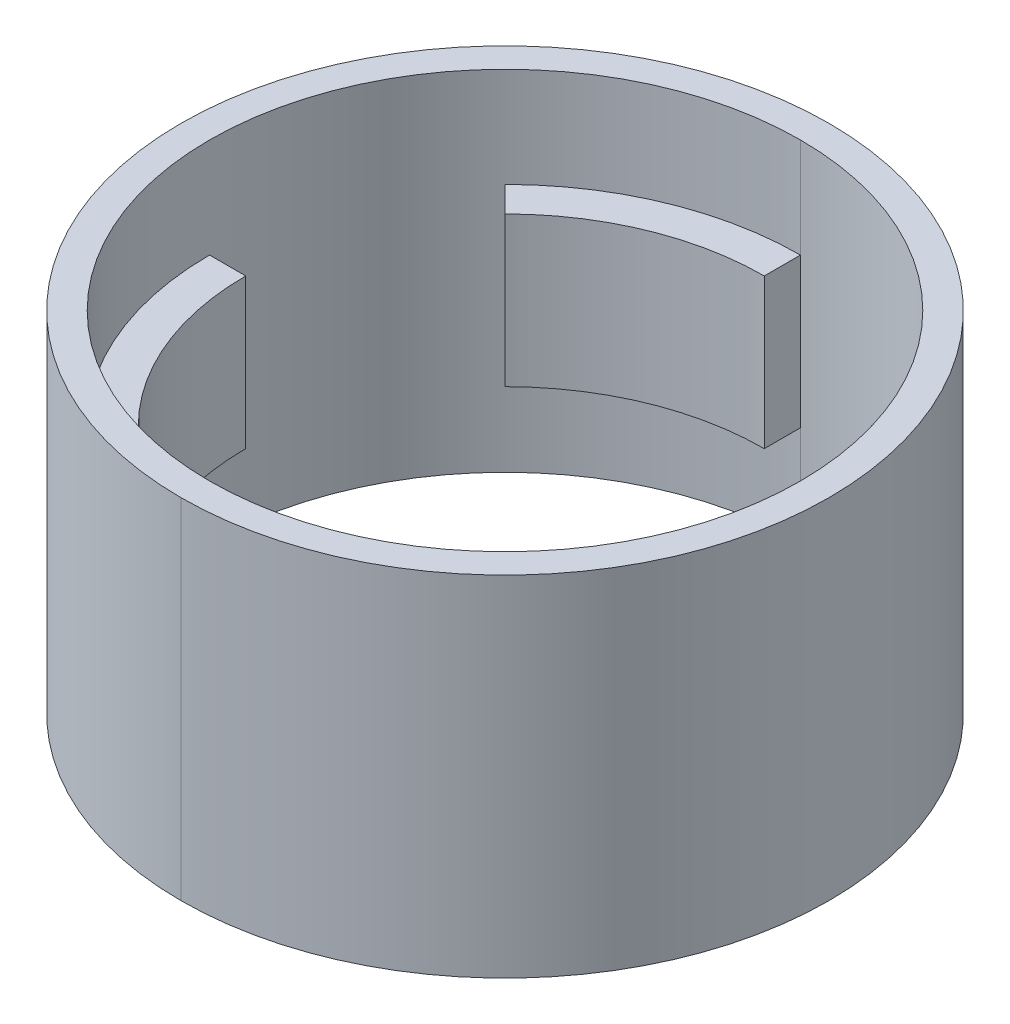
ISO-10303-21;
HEADER;
FILE_DESCRIPTION(('STEP AP214'),'2;1');
FILE_NAME('part.step','',(''),(''),'','','');
FILE_SCHEMA(('AUTOMOTIVE_DESIGN { 1 0 10303 214 1 1 1 1 }'));
ENDSEC;
DATA;
#1=APPLICATION_CONTEXT('core data for automotive mechanical design processes');
#2=APPLICATION_PROTOCOL_DEFINITION('international standard','automotive_design',2000,#1);
#3=PRODUCT_CONTEXT('',#1,'mechanical');
#4=PRODUCT('Part','Part','',(#3));
#5=PRODUCT_RELATED_PRODUCT_CATEGORY('part','',(#4));
#6=PRODUCT_DEFINITION_FORMATION('','',#4);
#7=PRODUCT_DEFINITION_CONTEXT('part definition',#1,'design');
#8=PRODUCT_DEFINITION('design','',#6,#7);
#9=PRODUCT_DEFINITION_SHAPE('','',#8);
#10=(LENGTH_UNIT() NAMED_UNIT(*) SI_UNIT(.MILLI.,.METRE.));
#11=(NAMED_UNIT(*) PLANE_ANGLE_UNIT() SI_UNIT($,.RADIAN.));
#12=(NAMED_UNIT(*) SI_UNIT($,.STERADIAN.) SOLID_ANGLE_UNIT());
#13=UNCERTAINTY_MEASURE_WITH_UNIT(LENGTH_MEASURE(1.E-05),#10,'distance_accuracy_value','');
#14=(GEOMETRIC_REPRESENTATION_CONTEXT(3) GLOBAL_UNCERTAINTY_ASSIGNED_CONTEXT((#13)) GLOBAL_UNIT_ASSIGNED_CONTEXT((#10,
#11,#12)) REPRESENTATION_CONTEXT('',''));
#15=CARTESIAN_POINT('',(0.,0.,0.));
#16=DIRECTION('',(0.,0.,1.));
#17=DIRECTION('',(1.,0.,0.));
#18=AXIS2_PLACEMENT_3D('',#15,#16,#17);
#19=CARTESIAN_POINT('',(0.,-7.25463117847063,0.));
#20=DIRECTION('',(0.,0.,1.));
#21=DIRECTION('',(1.,0.,0.));
#22=AXIS2_PLACEMENT_3D('',#19,#20,#21);
#23=PLANE('',#22);
#24=DIRECTION('',(1.,0.,0.));
#25=VECTOR('',#24,1.);
#26=CARTESIAN_POINT('',(0.,-2.5,0.));
#27=LINE('',#26,#25);
#28=CARTESIAN_POINT('',(5.2,-2.5,0.));
#29=VERTEX_POINT('',#28);
#30=CARTESIAN_POINT('',(5.925,-2.5,0.));
#31=VERTEX_POINT('',#30);
#32=EDGE_CURVE('E372',#29,#31,#27,.T.);
#33=ORIENTED_EDGE('',*,*,#32,.T.);
#34=DIRECTION('',(0.,1.,0.));
#35=VECTOR('',#34,1.);
#36=CARTESIAN_POINT('',(5.925,-7.25463117847063,0.));
#37=LINE('',#36,#35);
#38=CARTESIAN_POINT('',(5.925,0.5,0.));
#39=VERTEX_POINT('',#38);
#40=EDGE_CURVE('E26',#31,#39,#37,.T.);
#41=ORIENTED_EDGE('',*,*,#40,.T.);
#42=DIRECTION('',(1.,0.,0.));
#43=VECTOR('',#42,1.);
#44=CARTESIAN_POINT('',(0.,0.5,0.));
#45=LINE('',#44,#43);
#46=CARTESIAN_POINT('',(5.2,0.5,0.));
#47=VERTEX_POINT('',#46);
#48=EDGE_CURVE('E367',#47,#39,#45,.T.);
#49=ORIENTED_EDGE('',*,*,#48,.F.);
#50=DIRECTION('',(0.,1.,0.));
#51=VECTOR('',#50,1.);
#52=CARTESIAN_POINT('',(5.2,-7.25463117847063,0.));
#53=LINE('',#52,#51);
#54=EDGE_CURVE('E307',#29,#47,#53,.T.);
#55=ORIENTED_EDGE('',*,*,#54,.F.);
#56=EDGE_LOOP('',(#33,#41,#49,#55));
#57=FACE_BOUND('',#56,.T.);
#58=ADVANCED_FACE('F15',(#57),#23,.T.);
#59=CARTESIAN_POINT('',(0.,-7.25463117847063,0.));
#60=DIRECTION('',(-0.707106781186547,0.,0.707106781186548));
#61=DIRECTION('',(0.,1.,0.));
#62=AXIS2_PLACEMENT_3D('',#59,#60,#61);
#63=PLANE('',#62);
#64=DIRECTION('',(0.,1.,0.));
#65=VECTOR('',#64,1.);
#66=CARTESIAN_POINT('',(3.67695526217005,-7.25463117847063,3.67695526217004));
#67=LINE('',#66,#65);
#68=CARTESIAN_POINT('',(3.67695526217005,-2.5,3.67695526217004));
#69=VERTEX_POINT('',#68);
#70=CARTESIAN_POINT('',(3.67695526217005,0.5,3.67695526217004));
#71=VERTEX_POINT('',#70);
#72=EDGE_CURVE('E117',#69,#71,#67,.T.);
#73=ORIENTED_EDGE('',*,*,#72,.T.);
#74=DIRECTION('',(0.707106781186548,0.,0.707106781186547));
#75=VECTOR('',#74,1.);
#76=CARTESIAN_POINT('',(0.,0.5,0.));
#77=LINE('',#76,#75);
#78=CARTESIAN_POINT('',(4.18960767853029,0.5,4.18960767853029));
#79=VERTEX_POINT('',#78);
#80=EDGE_CURVE('E336',#71,#79,#77,.T.);
#81=ORIENTED_EDGE('',*,*,#80,.T.);
#82=DIRECTION('',(0.,1.,0.));
#83=VECTOR('',#82,1.);
#84=CARTESIAN_POINT('',(4.18960767853029,-7.25463117847063,4.18960767853029));
#85=LINE('',#84,#83);
#86=CARTESIAN_POINT('',(4.18960767853029,-2.5,4.18960767853029));
#87=VERTEX_POINT('',#86);
#88=EDGE_CURVE('E153',#87,#79,#85,.T.);
#89=ORIENTED_EDGE('',*,*,#88,.F.);
#90=DIRECTION('',(0.707106781186548,0.,0.707106781186547));
#91=VECTOR('',#90,1.);
#92=CARTESIAN_POINT('',(0.,-2.5,0.));
#93=LINE('',#92,#91);
#94=EDGE_CURVE('E303',#69,#87,#93,.T.);
#95=ORIENTED_EDGE('',*,*,#94,.F.);
#96=EDGE_LOOP('',(#73,#81,#89,#95));
#97=FACE_BOUND('',#96,.T.);
#98=ADVANCED_FACE('F17',(#97),#63,.F.);
#99=CARTESIAN_POINT('',(0.,-7.25463117847063,0.));
#100=DIRECTION('',(0.707106781186547,0.,0.707106781186548));
#101=DIRECTION('',(0.,-1.,0.));
#102=AXIS2_PLACEMENT_3D('',#99,#100,#101);
#103=PLANE('',#102);
#104=DIRECTION('',(0.707106781186548,0.,-0.707106781186547));
#105=VECTOR('',#104,1.);
#106=CARTESIAN_POINT('',(0.,-2.5,0.));
#107=LINE('',#106,#105);
#108=CARTESIAN_POINT('',(-4.18960767853029,-2.5,4.18960767853029));
#109=VERTEX_POINT('',#108);
#110=CARTESIAN_POINT('',(-3.67695526217004,-2.5,3.67695526217005));
#111=VERTEX_POINT('',#110);
#112=EDGE_CURVE('E362',#109,#111,#107,.T.);
#113=ORIENTED_EDGE('',*,*,#112,.T.);
#114=DIRECTION('',(0.,1.,0.));
#115=VECTOR('',#114,1.);
#116=CARTESIAN_POINT('',(-3.67695526217004,-7.25463117847063,3.67695526217005));
#117=LINE('',#116,#115);
#118=CARTESIAN_POINT('',(-3.67695526217004,0.5,3.67695526217005));
#119=VERTEX_POINT('',#118);
#120=EDGE_CURVE('E276',#111,#119,#117,.T.);
#121=ORIENTED_EDGE('',*,*,#120,.T.);
#122=DIRECTION('',(0.707106781186548,0.,-0.707106781186547));
#123=VECTOR('',#122,1.);
#124=CARTESIAN_POINT('',(0.,0.5,0.));
#125=LINE('',#124,#123);
#126=CARTESIAN_POINT('',(-4.18960767853029,0.5,4.18960767853029));
#127=VERTEX_POINT('',#126);
#128=EDGE_CURVE('E287',#127,#119,#125,.T.);
#129=ORIENTED_EDGE('',*,*,#128,.F.);
#130=DIRECTION('',(0.,1.,0.));
#131=VECTOR('',#130,1.);
#132=CARTESIAN_POINT('',(-4.18960767853029,-7.25463117847063,4.18960767853029));
#133=LINE('',#132,#131);
#134=EDGE_CURVE('E335',#109,#127,#133,.T.);
#135=ORIENTED_EDGE('',*,*,#134,.F.);
#136=EDGE_LOOP('',(#113,#121,#129,#135));
#137=FACE_BOUND('',#136,.T.);
#138=ADVANCED_FACE('F647',(#137),#103,.T.);
#139=CARTESIAN_POINT('',(0.,-7.25463117847063,0.));
#140=DIRECTION('',(-1.,0.,0.));
#141=DIRECTION('',(0.,0.,1.));
#142=AXIS2_PLACEMENT_3D('',#139,#140,#141);
#143=PLANE('',#142);
#144=DIRECTION('',(0.,0.,1.));
#145=VECTOR('',#144,1.);
#146=CARTESIAN_POINT('',(0.,-2.5,0.));
#147=LINE('',#146,#145);
#148=CARTESIAN_POINT('',(0.,-2.5,5.2));
#149=VERTEX_POINT('',#148);
#150=CARTESIAN_POINT('',(0.,-2.5,5.925));
#151=VERTEX_POINT('',#150);
#152=EDGE_CURVE('E302',#149,#151,#147,.T.);
#153=ORIENTED_EDGE('',*,*,#152,.T.);
#154=DIRECTION('',(0.,1.,0.));
#155=VECTOR('',#154,1.);
#156=CARTESIAN_POINT('',(0.,-7.25463117847063,5.925));
#157=LINE('',#156,#155);
#158=CARTESIAN_POINT('',(0.,0.5,5.925));
#159=VERTEX_POINT('',#158);
#160=EDGE_CURVE('E277',#151,#159,#157,.T.);
#161=ORIENTED_EDGE('',*,*,#160,.T.);
#162=DIRECTION('',(0.,0.,1.));
#163=VECTOR('',#162,1.);
#164=CARTESIAN_POINT('',(0.,0.5,0.));
#165=LINE('',#164,#163);
#166=CARTESIAN_POINT('',(0.,0.5,5.2));
#167=VERTEX_POINT('',#166);
#168=EDGE_CURVE('E288',#167,#159,#165,.T.);
#169=ORIENTED_EDGE('',*,*,#168,.F.);
#170=DIRECTION('',(0.,1.,0.));
#171=VECTOR('',#170,1.);
#172=CARTESIAN_POINT('',(0.,-7.25463117847063,5.2));
#173=LINE('',#172,#171);
#174=EDGE_CURVE('E347',#149,#167,#173,.T.);
#175=ORIENTED_EDGE('',*,*,#174,.F.);
#176=EDGE_LOOP('',(#153,#161,#169,#175));
#177=FACE_BOUND('',#176,.T.);
#178=ADVANCED_FACE('F651',(#177),#143,.T.);
#179=CARTESIAN_POINT('',(0.,-7.25463117847063,0.));
#180=DIRECTION('',(-0.707106781186547,0.,0.707106781186548));
#181=DIRECTION('',(0.,1.,0.));
#182=AXIS2_PLACEMENT_3D('',#179,#180,#181);
#183=PLANE('',#182);
#184=DIRECTION('',(0.707106781186548,0.,0.707106781186547));
#185=VECTOR('',#184,1.);
#186=CARTESIAN_POINT('',(0.,-2.5,0.));
#187=LINE('',#186,#185);
#188=CARTESIAN_POINT('',(-4.18960767853029,-2.5,-4.18960767853029));
#189=VERTEX_POINT('',#188);
#190=CARTESIAN_POINT('',(-3.67695526217004,-2.5,-3.67695526217005));
#191=VERTEX_POINT('',#190);
#192=EDGE_CURVE('E272',#189,#191,#187,.T.);
#193=ORIENTED_EDGE('',*,*,#192,.T.);
#194=DIRECTION('',(0.,1.,0.));
#195=VECTOR('',#194,1.);
#196=CARTESIAN_POINT('',(-3.67695526217004,-7.25463117847063,-3.67695526217005));
#197=LINE('',#196,#195);
#198=CARTESIAN_POINT('',(-3.67695526217004,0.5,-3.67695526217005));
#199=VERTEX_POINT('',#198);
#200=EDGE_CURVE('E41',#191,#199,#197,.T.);
#201=ORIENTED_EDGE('',*,*,#200,.T.);
#202=DIRECTION('',(0.707106781186548,0.,0.707106781186547));
#203=VECTOR('',#202,1.);
#204=CARTESIAN_POINT('',(0.,0.5,0.));
#205=LINE('',#204,#203);
#206=CARTESIAN_POINT('',(-4.18960767853029,0.5,-4.18960767853029));
#207=VERTEX_POINT('',#206);
#208=EDGE_CURVE('E216',#207,#199,#205,.T.);
#209=ORIENTED_EDGE('',*,*,#208,.F.);
#210=DIRECTION('',(0.,1.,0.));
#211=VECTOR('',#210,1.);
#212=CARTESIAN_POINT('',(-4.18960767853029,-7.25463117847063,-4.18960767853029));
#213=LINE('',#212,#211);
#214=EDGE_CURVE('E260',#189,#207,#213,.T.);
#215=ORIENTED_EDGE('',*,*,#214,.F.);
#216=EDGE_LOOP('',(#193,#201,#209,#215));
#217=FACE_BOUND('',#216,.T.);
#218=ADVANCED_FACE('F731',(#217),#183,.T.);
#219=CARTESIAN_POINT('',(0.,-7.25463117847063,0.));
#220=DIRECTION('',(0.,0.,1.));
#221=DIRECTION('',(1.,0.,0.));
#222=AXIS2_PLACEMENT_3D('',#219,#220,#221);
#223=PLANE('',#222);
#224=DIRECTION('',(0.,1.,0.));
#225=VECTOR('',#224,1.);
#226=CARTESIAN_POINT('',(-5.925,-7.25463117847063,0.));
#227=LINE('',#226,#225);
#228=CARTESIAN_POINT('',(-5.925,-2.5,0.));
#229=VERTEX_POINT('',#228);
#230=CARTESIAN_POINT('',(-5.925,0.5,0.));
#231=VERTEX_POINT('',#230);
#232=EDGE_CURVE('E324',#229,#231,#227,.T.);
#233=ORIENTED_EDGE('',*,*,#232,.T.);
#234=DIRECTION('',(1.,0.,0.));
#235=VECTOR('',#234,1.);
#236=CARTESIAN_POINT('',(0.,0.5,0.));
#237=LINE('',#236,#235);
#238=CARTESIAN_POINT('',(-5.2,0.5,0.));
#239=VERTEX_POINT('',#238);
#240=EDGE_CURVE('E403',#231,#239,#237,.T.);
#241=ORIENTED_EDGE('',*,*,#240,.T.);
#242=DIRECTION('',(0.,1.,0.));
#243=VECTOR('',#242,1.);
#244=CARTESIAN_POINT('',(-5.2,-7.25463117847063,0.));
#245=LINE('',#244,#243);
#246=CARTESIAN_POINT('',(-5.2,-2.5,0.));
#247=VERTEX_POINT('',#246);
#248=EDGE_CURVE('E274',#247,#239,#245,.T.);
#249=ORIENTED_EDGE('',*,*,#248,.F.);
#250=DIRECTION('',(1.,0.,0.));
#251=VECTOR('',#250,1.);
#252=CARTESIAN_POINT('',(0.,-2.5,0.));
#253=LINE('',#252,#251);
#254=EDGE_CURVE('E293',#229,#247,#253,.T.);
#255=ORIENTED_EDGE('',*,*,#254,.F.);
#256=EDGE_LOOP('',(#233,#241,#249,#255));
#257=FACE_BOUND('',#256,.T.);
#258=ADVANCED_FACE('F726',(#257),#223,.F.);
#259=CARTESIAN_POINT('',(0.,-7.25463117847063,0.));
#260=DIRECTION('',(-1.,0.,0.));
#261=DIRECTION('',(0.,0.,1.));
#262=AXIS2_PLACEMENT_3D('',#259,#260,#261);
#263=PLANE('',#262);
#264=DIRECTION('',(0.,1.,0.));
#265=VECTOR('',#264,1.);
#266=CARTESIAN_POINT('',(0.,-7.25463117847063,-5.925));
#267=LINE('',#266,#265);
#268=CARTESIAN_POINT('',(0.,-2.5,-5.925));
#269=VERTEX_POINT('',#268);
#270=CARTESIAN_POINT('',(0.,0.5,-5.925));
#271=VERTEX_POINT('',#270);
#272=EDGE_CURVE('E224',#269,#271,#267,.T.);
#273=ORIENTED_EDGE('',*,*,#272,.T.);
#274=DIRECTION('',(0.,0.,1.));
#275=VECTOR('',#274,1.);
#276=CARTESIAN_POINT('',(0.,0.5,0.));
#277=LINE('',#276,#275);
#278=CARTESIAN_POINT('',(0.,0.5,-5.2));
#279=VERTEX_POINT('',#278);
#280=EDGE_CURVE('E227',#271,#279,#277,.T.);
#281=ORIENTED_EDGE('',*,*,#280,.T.);
#282=DIRECTION('',(0.,1.,0.));
#283=VECTOR('',#282,1.);
#284=CARTESIAN_POINT('',(0.,-7.25463117847063,-5.2));
#285=LINE('',#284,#283);
#286=CARTESIAN_POINT('',(0.,-2.5,-5.2));
#287=VERTEX_POINT('',#286);
#288=EDGE_CURVE('E316',#287,#279,#285,.T.);
#289=ORIENTED_EDGE('',*,*,#288,.F.);
#290=DIRECTION('',(0.,0.,1.));
#291=VECTOR('',#290,1.);
#292=CARTESIAN_POINT('',(0.,-2.5,0.));
#293=LINE('',#292,#291);
#294=EDGE_CURVE('E230',#269,#287,#293,.T.);
#295=ORIENTED_EDGE('',*,*,#294,.F.);
#296=EDGE_LOOP('',(#273,#281,#289,#295));
#297=FACE_BOUND('',#296,.T.);
#298=ADVANCED_FACE('F226',(#297),#263,.F.);
#299=CARTESIAN_POINT('',(0.,-7.25463117847063,0.));
#300=DIRECTION('',(0.707106781186547,0.,0.707106781186548));
#301=DIRECTION('',(0.,-1.,0.));
#302=AXIS2_PLACEMENT_3D('',#299,#300,#301);
#303=PLANE('',#302);
#304=DIRECTION('',(0.,1.,0.));
#305=VECTOR('',#304,1.);
#306=CARTESIAN_POINT('',(3.67695526217005,-7.25463117847063,-3.67695526217004));
#307=LINE('',#306,#305);
#308=CARTESIAN_POINT('',(3.67695526217005,-2.5,-3.67695526217004));
#309=VERTEX_POINT('',#308);
#310=CARTESIAN_POINT('',(3.67695526217005,0.5,-3.67695526217004));
#311=VERTEX_POINT('',#310);
#312=EDGE_CURVE('E304',#309,#311,#307,.T.);
#313=ORIENTED_EDGE('',*,*,#312,.T.);
#314=DIRECTION('',(0.707106781186548,0.,-0.707106781186547));
#315=VECTOR('',#314,1.);
#316=CARTESIAN_POINT('',(0.,0.5,0.));
#317=LINE('',#316,#315);
#318=CARTESIAN_POINT('',(4.18960767853029,0.5,-4.18960767853029));
#319=VERTEX_POINT('',#318);
#320=EDGE_CURVE('E19',#311,#319,#317,.T.);
#321=ORIENTED_EDGE('',*,*,#320,.T.);
#322=DIRECTION('',(0.,1.,0.));
#323=VECTOR('',#322,1.);
#324=CARTESIAN_POINT('',(4.18960767853029,-7.25463117847063,-4.18960767853029));
#325=LINE('',#324,#323);
#326=CARTESIAN_POINT('',(4.18960767853029,-2.5,-4.18960767853029));
#327=VERTEX_POINT('',#326);
#328=EDGE_CURVE('E10',#327,#319,#325,.T.);
#329=ORIENTED_EDGE('',*,*,#328,.F.);
#330=DIRECTION('',(0.707106781186548,0.,-0.707106781186547));
#331=VECTOR('',#330,1.);
#332=CARTESIAN_POINT('',(0.,-2.5,0.));
#333=LINE('',#332,#331);
#334=EDGE_CURVE('E415',#309,#327,#333,.T.);
#335=ORIENTED_EDGE('',*,*,#334,.F.);
#336=EDGE_LOOP('',(#313,#321,#329,#335));
#337=FACE_BOUND('',#336,.T.);
#338=ADVANCED_FACE('F725',(#337),#303,.F.);
#339=CARTESIAN_POINT('',(0.,-4.5,0.));
#340=DIRECTION('',(0.,-1.,0.));
#341=DIRECTION('',(0.,0.,-1.));
#342=AXIS2_PLACEMENT_3D('',#339,#340,#341);
#343=PLANE('',#342);
#344=CARTESIAN_POINT('',(0.,-4.5,0.));
#345=DIRECTION('',(0.,-1.,0.));
#346=DIRECTION('',(0.,0.,-1.));
#347=AXIS2_PLACEMENT_3D('',#344,#345,#346);
#348=CIRCLE('',#347,5.925);
#349=CARTESIAN_POINT('',(0.,-4.5,5.925));
#350=VERTEX_POINT('',#349);
#351=CARTESIAN_POINT('',(0.,-4.5,-5.925));
#352=VERTEX_POINT('',#351);
#353=EDGE_CURVE('E329',#350,#352,#348,.T.);
#354=ORIENTED_EDGE('',*,*,#353,.F.);
#355=CARTESIAN_POINT('',(0.,-4.5,0.));
#356=DIRECTION('',(0.,-1.,0.));
#357=DIRECTION('',(0.,0.,-1.));
#358=AXIS2_PLACEMENT_3D('',#355,#356,#357);
#359=CIRCLE('',#358,5.925);
#360=EDGE_CURVE('E382',#352,#350,#359,.T.);
#361=ORIENTED_EDGE('',*,*,#360,.F.);
#362=EDGE_LOOP('',(#354,#361));
#363=FACE_BOUND('',#362,.T.);
#364=CARTESIAN_POINT('',(0.,-4.5,0.));
#365=DIRECTION('',(0.,-1.,0.));
#366=DIRECTION('',(0.,0.,-1.));
#367=AXIS2_PLACEMENT_3D('',#364,#365,#366);
#368=CIRCLE('',#367,6.5);
#369=CARTESIAN_POINT('',(0.,-4.5,-6.5));
#370=VERTEX_POINT('',#369);
#371=CARTESIAN_POINT('',(0.,-4.5,6.5));
#372=VERTEX_POINT('',#371);
#373=EDGE_CURVE('E407',#370,#372,#368,.T.);
#374=ORIENTED_EDGE('',*,*,#373,.T.);
#375=CARTESIAN_POINT('',(0.,-4.5,0.));
#376=DIRECTION('',(0.,-1.,0.));
#377=DIRECTION('',(0.,0.,-1.));
#378=AXIS2_PLACEMENT_3D('',#375,#376,#377);
#379=CIRCLE('',#378,6.5);
#380=EDGE_CURVE('E393',#372,#370,#379,.T.);
#381=ORIENTED_EDGE('',*,*,#380,.T.);
#382=EDGE_LOOP('',(#374,#381));
#383=FACE_BOUND('',#382,.T.);
#384=ADVANCED_FACE('F777',(#363,#383),#343,.T.);
#385=CARTESIAN_POINT('',(0.,0.5,0.));
#386=DIRECTION('',(0.,1.,0.));
#387=DIRECTION('',(0.,0.,1.));
#388=AXIS2_PLACEMENT_3D('',#385,#386,#387);
#389=CYLINDRICAL_SURFACE('',#388,5.925);
#390=CARTESIAN_POINT('',(0.,0.5,0.));
#391=DIRECTION('',(0.,1.,0.));
#392=DIRECTION('',(0.,0.,1.));
#393=AXIS2_PLACEMENT_3D('',#390,#391,#392);
#394=CIRCLE('',#393,5.925);
#395=EDGE_CURVE('E388',#39,#319,#394,.T.);
#396=ORIENTED_EDGE('',*,*,#395,.F.);
#397=ORIENTED_EDGE('',*,*,#40,.F.);
#398=CARTESIAN_POINT('',(0.,-2.5,0.));
#399=DIRECTION('',(0.,-1.,0.));
#400=DIRECTION('',(0.,0.,-1.));
#401=AXIS2_PLACEMENT_3D('',#398,#399,#400);
#402=CIRCLE('',#401,5.925);
#403=EDGE_CURVE('E244',#327,#31,#402,.T.);
#404=ORIENTED_EDGE('',*,*,#403,.F.);
#405=ORIENTED_EDGE('',*,*,#328,.T.);
#406=EDGE_LOOP('',(#396,#397,#404,#405));
#407=FACE_BOUND('',#406,.T.);
#408=DIRECTION('',(0.,1.,0.));
#409=VECTOR('',#408,1.);
#410=CARTESIAN_POINT('',(0.,0.5,-5.925));
#411=LINE('',#410,#409);
#412=EDGE_CURVE('E325',#352,#269,#411,.T.);
#413=ORIENTED_EDGE('',*,*,#412,.F.);
#414=ORIENTED_EDGE('',*,*,#360,.T.);
#415=DIRECTION('',(0.,1.,0.));
#416=VECTOR('',#415,1.);
#417=CARTESIAN_POINT('',(0.,0.5,5.925));
#418=LINE('',#417,#416);
#419=EDGE_CURVE('E281',#350,#151,#418,.T.);
#420=ORIENTED_EDGE('',*,*,#419,.T.);
#421=CARTESIAN_POINT('',(0.,-2.5,0.));
#422=DIRECTION('',(0.,-1.,0.));
#423=DIRECTION('',(0.,0.,-1.));
#424=AXIS2_PLACEMENT_3D('',#421,#422,#423);
#425=CIRCLE('',#424,5.925);
#426=EDGE_CURVE('E298',#87,#151,#425,.T.);
#427=ORIENTED_EDGE('',*,*,#426,.F.);
#428=ORIENTED_EDGE('',*,*,#88,.T.);
#429=CARTESIAN_POINT('',(0.,0.5,0.));
#430=DIRECTION('',(0.,1.,0.));
#431=DIRECTION('',(0.,0.,1.));
#432=AXIS2_PLACEMENT_3D('',#429,#430,#431);
#433=CIRCLE('',#432,5.925);
#434=EDGE_CURVE('E283',#159,#79,#433,.T.);
#435=ORIENTED_EDGE('',*,*,#434,.F.);
#436=DIRECTION('',(0.,1.,0.));
#437=VECTOR('',#436,1.);
#438=CARTESIAN_POINT('',(0.,0.5,5.925));
#439=LINE('',#438,#437);
#440=CARTESIAN_POINT('',(0.,2.5,5.925));
#441=VERTEX_POINT('',#440);
#442=EDGE_CURVE('E282',#159,#441,#439,.T.);
#443=ORIENTED_EDGE('',*,*,#442,.T.);
#444=CARTESIAN_POINT('',(0.,2.5,0.));
#445=DIRECTION('',(0.,1.,0.));
#446=DIRECTION('',(0.,0.,1.));
#447=AXIS2_PLACEMENT_3D('',#444,#445,#446);
#448=CIRCLE('',#447,5.925);
#449=CARTESIAN_POINT('',(0.,2.5,-5.925));
#450=VERTEX_POINT('',#449);
#451=EDGE_CURVE('E250',#441,#450,#448,.T.);
#452=ORIENTED_EDGE('',*,*,#451,.T.);
#453=DIRECTION('',(0.,1.,0.));
#454=VECTOR('',#453,1.);
#455=CARTESIAN_POINT('',(0.,0.5,-5.925));
#456=LINE('',#455,#454);
#457=EDGE_CURVE('E247',#271,#450,#456,.T.);
#458=ORIENTED_EDGE('',*,*,#457,.F.);
#459=ORIENTED_EDGE('',*,*,#272,.F.);
#460=EDGE_LOOP('',(#413,#414,#420,#427,#428,#435,#443,#452,#458,#459));
#461=FACE_BOUND('',#460,.T.);
#462=ADVANCED_FACE('F248',(#407,#461),#389,.F.);
#463=CARTESIAN_POINT('',(0.,2.5,0.));
#464=DIRECTION('',(0.,-1.,0.));
#465=DIRECTION('',(0.,0.,-1.));
#466=AXIS2_PLACEMENT_3D('',#463,#464,#465);
#467=CYLINDRICAL_SURFACE('',#466,6.5);
#468=DIRECTION('',(0.,-1.,0.));
#469=VECTOR('',#468,1.);
#470=CARTESIAN_POINT('',(0.,2.5,6.5));
#471=LINE('',#470,#469);
#472=CARTESIAN_POINT('',(0.,2.5,6.5));
#473=VERTEX_POINT('',#472);
#474=EDGE_CURVE('E334',#473,#372,#471,.T.);
#475=ORIENTED_EDGE('',*,*,#474,.F.);
#476=CARTESIAN_POINT('',(0.,2.5,0.));
#477=DIRECTION('',(0.,1.,0.));
#478=DIRECTION('',(0.,0.,1.));
#479=AXIS2_PLACEMENT_3D('',#476,#477,#478);
#480=CIRCLE('',#479,6.5);
#481=CARTESIAN_POINT('',(0.,2.5,-6.5));
#482=VERTEX_POINT('',#481);
#483=EDGE_CURVE('E342',#482,#473,#480,.T.);
#484=ORIENTED_EDGE('',*,*,#483,.F.);
#485=DIRECTION('',(0.,-1.,0.));
#486=VECTOR('',#485,1.);
#487=CARTESIAN_POINT('',(0.,2.5,-6.5));
#488=LINE('',#487,#486);
#489=EDGE_CURVE('E368',#482,#370,#488,.T.);
#490=ORIENTED_EDGE('',*,*,#489,.T.);
#491=ORIENTED_EDGE('',*,*,#380,.F.);
#492=EDGE_LOOP('',(#475,#484,#490,#491));
#493=FACE_BOUND('',#492,.T.);
#494=ADVANCED_FACE('F743',(#493),#467,.T.);
#495=CARTESIAN_POINT('',(0.,2.5,0.));
#496=DIRECTION('',(0.,1.,0.));
#497=DIRECTION('',(1.,0.,0.));
#498=AXIS2_PLACEMENT_3D('',#495,#496,#497);
#499=PLANE('',#498);
#500=ORIENTED_EDGE('',*,*,#451,.F.);
#501=CARTESIAN_POINT('',(0.,2.5,0.));
#502=DIRECTION('',(0.,1.,0.));
#503=DIRECTION('',(0.,0.,1.));
#504=AXIS2_PLACEMENT_3D('',#501,#502,#503);
#505=CIRCLE('',#504,5.925);
#506=EDGE_CURVE('E255',#450,#441,#505,.T.);
#507=ORIENTED_EDGE('',*,*,#506,.F.);
#508=EDGE_LOOP('',(#500,#507));
#509=FACE_BOUND('',#508,.T.);
#510=ORIENTED_EDGE('',*,*,#483,.T.);
#511=CARTESIAN_POINT('',(0.,2.5,0.));
#512=DIRECTION('',(0.,1.,0.));
#513=DIRECTION('',(0.,0.,1.));
#514=AXIS2_PLACEMENT_3D('',#511,#512,#513);
#515=CIRCLE('',#514,6.5);
#516=EDGE_CURVE('E330',#473,#482,#515,.T.);
#517=ORIENTED_EDGE('',*,*,#516,.T.);
#518=EDGE_LOOP('',(#510,#517));
#519=FACE_BOUND('',#518,.T.);
#520=ADVANCED_FACE('F739',(#509,#519),#499,.T.);
#521=CARTESIAN_POINT('',(0.,18.8847763108502,0.));
#522=DIRECTION('',(0.,-1.,0.));
#523=DIRECTION('',(0.,0.,-1.));
#524=AXIS2_PLACEMENT_3D('',#521,#522,#523);
#525=CYLINDRICAL_SURFACE('',#524,5.2);
#526=CARTESIAN_POINT('',(0.,0.5,0.));
#527=DIRECTION('',(0.,1.,0.));
#528=DIRECTION('',(0.,0.,1.));
#529=AXIS2_PLACEMENT_3D('',#526,#527,#528);
#530=CIRCLE('',#529,5.2);
#531=EDGE_CURVE('E242',#279,#199,#530,.T.);
#532=ORIENTED_EDGE('',*,*,#531,.T.);
#533=ORIENTED_EDGE('',*,*,#200,.F.);
#534=CARTESIAN_POINT('',(0.,-2.5,0.));
#535=DIRECTION('',(0.,1.,0.));
#536=DIRECTION('',(0.,0.,-1.));
#537=AXIS2_PLACEMENT_3D('',#534,#535,#536);
#538=CIRCLE('',#537,5.2);
#539=EDGE_CURVE('E289',#287,#191,#538,.T.);
#540=ORIENTED_EDGE('',*,*,#539,.F.);
#541=ORIENTED_EDGE('',*,*,#288,.T.);
#542=EDGE_LOOP('',(#532,#533,#540,#541));
#543=FACE_BOUND('',#542,.T.);
#544=ADVANCED_FACE('F693',(#543),#525,.F.);
#545=CARTESIAN_POINT('',(0.,18.8847763108502,0.));
#546=DIRECTION('',(0.,-1.,0.));
#547=DIRECTION('',(0.,0.,-1.));
#548=AXIS2_PLACEMENT_3D('',#545,#546,#547);
#549=CYLINDRICAL_SURFACE('',#548,5.2);
#550=CARTESIAN_POINT('',(0.,0.5,0.));
#551=DIRECTION('',(0.,1.,0.));
#552=DIRECTION('',(0.,0.,1.));
#553=AXIS2_PLACEMENT_3D('',#550,#551,#552);
#554=CIRCLE('',#553,5.2);
#555=EDGE_CURVE('E399',#239,#119,#554,.T.);
#556=ORIENTED_EDGE('',*,*,#555,.T.);
#557=ORIENTED_EDGE('',*,*,#120,.F.);
#558=CARTESIAN_POINT('',(0.,-2.5,0.));
#559=DIRECTION('',(0.,1.,0.));
#560=DIRECTION('',(0.,0.,-1.));
#561=AXIS2_PLACEMENT_3D('',#558,#559,#560);
#562=CIRCLE('',#561,5.2);
#563=EDGE_CURVE('E358',#247,#111,#562,.T.);
#564=ORIENTED_EDGE('',*,*,#563,.F.);
#565=ORIENTED_EDGE('',*,*,#248,.T.);
#566=EDGE_LOOP('',(#556,#557,#564,#565));
#567=FACE_BOUND('',#566,.T.);
#568=ADVANCED_FACE('F688',(#567),#549,.F.);
#569=CARTESIAN_POINT('',(0.,18.8847763108502,0.));
#570=DIRECTION('',(0.,-1.,0.));
#571=DIRECTION('',(0.,0.,-1.));
#572=AXIS2_PLACEMENT_3D('',#569,#570,#571);
#573=CYLINDRICAL_SURFACE('',#572,5.2);
#574=ORIENTED_EDGE('',*,*,#72,.F.);
#575=CARTESIAN_POINT('',(0.,-2.5,0.));
#576=DIRECTION('',(0.,1.,0.));
#577=DIRECTION('',(0.,0.,-1.));
#578=AXIS2_PLACEMENT_3D('',#575,#576,#577);
#579=CIRCLE('',#578,5.2);
#580=EDGE_CURVE('E352',#149,#69,#579,.T.);
#581=ORIENTED_EDGE('',*,*,#580,.F.);
#582=ORIENTED_EDGE('',*,*,#174,.T.);
#583=CARTESIAN_POINT('',(0.,0.5,0.));
#584=DIRECTION('',(0.,1.,0.));
#585=DIRECTION('',(0.,0.,1.));
#586=AXIS2_PLACEMENT_3D('',#583,#584,#585);
#587=CIRCLE('',#586,5.2);
#588=EDGE_CURVE('E339',#167,#71,#587,.T.);
#589=ORIENTED_EDGE('',*,*,#588,.T.);
#590=EDGE_LOOP('',(#574,#581,#582,#589));
#591=FACE_BOUND('',#590,.T.);
#592=ADVANCED_FACE('F692',(#591),#573,.F.);
#593=CARTESIAN_POINT('',(0.,18.8847763108502,0.));
#594=DIRECTION('',(0.,-1.,0.));
#595=DIRECTION('',(0.,0.,-1.));
#596=AXIS2_PLACEMENT_3D('',#593,#594,#595);
#597=CYLINDRICAL_SURFACE('',#596,5.2);
#598=CARTESIAN_POINT('',(0.,-2.5,0.));
#599=DIRECTION('',(0.,1.,0.));
#600=DIRECTION('',(0.,0.,-1.));
#601=AXIS2_PLACEMENT_3D('',#598,#599,#600);
#602=CIRCLE('',#601,5.2);
#603=EDGE_CURVE('E423',#29,#309,#602,.T.);
#604=ORIENTED_EDGE('',*,*,#603,.F.);
#605=ORIENTED_EDGE('',*,*,#54,.T.);
#606=CARTESIAN_POINT('',(0.,0.5,0.));
#607=DIRECTION('',(0.,1.,0.));
#608=DIRECTION('',(0.,0.,1.));
#609=AXIS2_PLACEMENT_3D('',#606,#607,#608);
#610=CIRCLE('',#609,5.2);
#611=EDGE_CURVE('E363',#47,#311,#610,.T.);
#612=ORIENTED_EDGE('',*,*,#611,.T.);
#613=ORIENTED_EDGE('',*,*,#312,.F.);
#614=EDGE_LOOP('',(#604,#605,#612,#613));
#615=FACE_BOUND('',#614,.T.);
#616=ADVANCED_FACE('F752',(#615),#597,.F.);
#617=CARTESIAN_POINT('',(0.,-2.5,0.));
#618=DIRECTION('',(0.,-1.,0.));
#619=DIRECTION('',(0.,0.,-1.));
#620=AXIS2_PLACEMENT_3D('',#617,#618,#619);
#621=PLANE('',#620);
#622=ORIENTED_EDGE('',*,*,#539,.T.);
#623=ORIENTED_EDGE('',*,*,#192,.F.);
#624=CARTESIAN_POINT('',(0.,-2.5,0.));
#625=DIRECTION('',(0.,-1.,0.));
#626=DIRECTION('',(0.,0.,-1.));
#627=AXIS2_PLACEMENT_3D('',#624,#625,#626);
#628=CIRCLE('',#627,5.925);
#629=EDGE_CURVE('E268',#189,#269,#628,.T.);
#630=ORIENTED_EDGE('',*,*,#629,.T.);
#631=ORIENTED_EDGE('',*,*,#294,.T.);
#632=EDGE_LOOP('',(#622,#623,#630,#631));
#633=FACE_BOUND('',#632,.T.);
#634=ADVANCED_FACE('F682',(#633),#621,.T.);
#635=CARTESIAN_POINT('',(0.,-2.5,0.));
#636=DIRECTION('',(0.,-1.,0.));
#637=DIRECTION('',(0.,0.,-1.));
#638=AXIS2_PLACEMENT_3D('',#635,#636,#637);
#639=PLANE('',#638);
#640=ORIENTED_EDGE('',*,*,#563,.T.);
#641=ORIENTED_EDGE('',*,*,#112,.F.);
#642=CARTESIAN_POINT('',(0.,-2.5,0.));
#643=DIRECTION('',(0.,-1.,0.));
#644=DIRECTION('',(0.,0.,-1.));
#645=AXIS2_PLACEMENT_3D('',#642,#643,#644);
#646=CIRCLE('',#645,5.925);
#647=EDGE_CURVE('E376',#109,#229,#646,.T.);
#648=ORIENTED_EDGE('',*,*,#647,.T.);
#649=ORIENTED_EDGE('',*,*,#254,.T.);
#650=EDGE_LOOP('',(#640,#641,#648,#649));
#651=FACE_BOUND('',#650,.T.);
#652=ADVANCED_FACE('F677',(#651),#639,.T.);
#653=CARTESIAN_POINT('',(0.,-2.5,0.));
#654=DIRECTION('',(0.,-1.,0.));
#655=DIRECTION('',(0.,0.,-1.));
#656=AXIS2_PLACEMENT_3D('',#653,#654,#655);
#657=PLANE('',#656);
#658=ORIENTED_EDGE('',*,*,#94,.T.);
#659=ORIENTED_EDGE('',*,*,#426,.T.);
#660=ORIENTED_EDGE('',*,*,#152,.F.);
#661=ORIENTED_EDGE('',*,*,#580,.T.);
#662=EDGE_LOOP('',(#658,#659,#660,#661));
#663=FACE_BOUND('',#662,.T.);
#664=ADVANCED_FACE('F681',(#663),#657,.T.);
#665=CARTESIAN_POINT('',(0.,-2.5,0.));
#666=DIRECTION('',(0.,-1.,0.));
#667=DIRECTION('',(0.,0.,-1.));
#668=AXIS2_PLACEMENT_3D('',#665,#666,#667);
#669=PLANE('',#668);
#670=ORIENTED_EDGE('',*,*,#403,.T.);
#671=ORIENTED_EDGE('',*,*,#32,.F.);
#672=ORIENTED_EDGE('',*,*,#603,.T.);
#673=ORIENTED_EDGE('',*,*,#334,.T.);
#674=EDGE_LOOP('',(#670,#671,#672,#673));
#675=FACE_BOUND('',#674,.T.);
#676=ADVANCED_FACE('F808',(#675),#669,.T.);
#677=CARTESIAN_POINT('',(0.,0.5,0.));
#678=DIRECTION('',(0.,1.,0.));
#679=DIRECTION('',(1.,0.,0.));
#680=AXIS2_PLACEMENT_3D('',#677,#678,#679);
#681=PLANE('',#680);
#682=CARTESIAN_POINT('',(0.,0.5,0.));
#683=DIRECTION('',(0.,1.,0.));
#684=DIRECTION('',(0.,0.,1.));
#685=AXIS2_PLACEMENT_3D('',#682,#683,#684);
#686=CIRCLE('',#685,5.925);
#687=EDGE_CURVE('E240',#271,#207,#686,.T.);
#688=ORIENTED_EDGE('',*,*,#687,.T.);
#689=ORIENTED_EDGE('',*,*,#208,.T.);
#690=ORIENTED_EDGE('',*,*,#531,.F.);
#691=ORIENTED_EDGE('',*,*,#280,.F.);
#692=EDGE_LOOP('',(#688,#689,#690,#691));
#693=FACE_BOUND('',#692,.T.);
#694=ADVANCED_FACE('F238',(#693),#681,.T.);
#695=CARTESIAN_POINT('',(0.,0.5,0.));
#696=DIRECTION('',(0.,1.,0.));
#697=DIRECTION('',(1.,0.,0.));
#698=AXIS2_PLACEMENT_3D('',#695,#696,#697);
#699=PLANE('',#698);
#700=CARTESIAN_POINT('',(0.,0.5,0.));
#701=DIRECTION('',(0.,1.,0.));
#702=DIRECTION('',(0.,0.,1.));
#703=AXIS2_PLACEMENT_3D('',#700,#701,#702);
#704=CIRCLE('',#703,5.925);
#705=EDGE_CURVE('E320',#231,#127,#704,.T.);
#706=ORIENTED_EDGE('',*,*,#705,.T.);
#707=ORIENTED_EDGE('',*,*,#128,.T.);
#708=ORIENTED_EDGE('',*,*,#555,.F.);
#709=ORIENTED_EDGE('',*,*,#240,.F.);
#710=EDGE_LOOP('',(#706,#707,#708,#709));
#711=FACE_BOUND('',#710,.T.);
#712=ADVANCED_FACE('F667',(#711),#699,.T.);
#713=CARTESIAN_POINT('',(0.,0.5,0.));
#714=DIRECTION('',(0.,1.,0.));
#715=DIRECTION('',(1.,0.,0.));
#716=AXIS2_PLACEMENT_3D('',#713,#714,#715);
#717=PLANE('',#716);
#718=ORIENTED_EDGE('',*,*,#80,.F.);
#719=ORIENTED_EDGE('',*,*,#588,.F.);
#720=ORIENTED_EDGE('',*,*,#168,.T.);
#721=ORIENTED_EDGE('',*,*,#434,.T.);
#722=EDGE_LOOP('',(#718,#719,#720,#721));
#723=FACE_BOUND('',#722,.T.);
#724=ADVANCED_FACE('F671',(#723),#717,.T.);
#725=CARTESIAN_POINT('',(0.,0.5,0.));
#726=DIRECTION('',(0.,1.,0.));
#727=DIRECTION('',(1.,0.,0.));
#728=AXIS2_PLACEMENT_3D('',#725,#726,#727);
#729=PLANE('',#728);
#730=ORIENTED_EDGE('',*,*,#611,.F.);
#731=ORIENTED_EDGE('',*,*,#48,.T.);
#732=ORIENTED_EDGE('',*,*,#395,.T.);
#733=ORIENTED_EDGE('',*,*,#320,.F.);
#734=EDGE_LOOP('',(#730,#731,#732,#733));
#735=FACE_BOUND('',#734,.T.);
#736=ADVANCED_FACE('F661',(#735),#729,.T.);
#737=CARTESIAN_POINT('',(0.,2.5,0.));
#738=DIRECTION('',(0.,-1.,0.));
#739=DIRECTION('',(0.,0.,-1.));
#740=AXIS2_PLACEMENT_3D('',#737,#738,#739);
#741=CYLINDRICAL_SURFACE('',#740,6.5);
#742=ORIENTED_EDGE('',*,*,#516,.F.);
#743=ORIENTED_EDGE('',*,*,#474,.T.);
#744=ORIENTED_EDGE('',*,*,#373,.F.);
#745=ORIENTED_EDGE('',*,*,#489,.F.);
#746=EDGE_LOOP('',(#742,#743,#744,#745));
#747=FACE_BOUND('',#746,.T.);
#748=ADVANCED_FACE('F657',(#747),#741,.T.);
#749=CARTESIAN_POINT('',(0.,0.5,0.));
#750=DIRECTION('',(0.,1.,0.));
#751=DIRECTION('',(0.,0.,1.));
#752=AXIS2_PLACEMENT_3D('',#749,#750,#751);
#753=CYLINDRICAL_SURFACE('',#752,5.925);
#754=ORIENTED_EDGE('',*,*,#705,.F.);
#755=ORIENTED_EDGE('',*,*,#232,.F.);
#756=ORIENTED_EDGE('',*,*,#647,.F.);
#757=ORIENTED_EDGE('',*,*,#134,.T.);
#758=EDGE_LOOP('',(#754,#755,#756,#757));
#759=FACE_BOUND('',#758,.T.);
#760=ORIENTED_EDGE('',*,*,#353,.T.);
#761=ORIENTED_EDGE('',*,*,#412,.T.);
#762=ORIENTED_EDGE('',*,*,#629,.F.);
#763=ORIENTED_EDGE('',*,*,#214,.T.);
#764=ORIENTED_EDGE('',*,*,#687,.F.);
#765=ORIENTED_EDGE('',*,*,#457,.T.);
#766=ORIENTED_EDGE('',*,*,#506,.T.);
#767=ORIENTED_EDGE('',*,*,#442,.F.);
#768=ORIENTED_EDGE('',*,*,#160,.F.);
#769=ORIENTED_EDGE('',*,*,#419,.F.);
#770=EDGE_LOOP('',(#760,#761,#762,#763,#764,#765,#766,#767,#768,#769));
#771=FACE_BOUND('',#770,.T.);
#772=ADVANCED_FACE('F258',(#759,#771),#753,.F.);
#773=CLOSED_SHELL('',(#58,#98,#138,#178,#218,#258,#298,#338,#384,#462,#494,#520,#544,#568,#592,
#616,#634,#652,#664,#676,#694,#712,#724,#736,#748,#772));
#774=MANIFOLD_SOLID_BREP('B1',#773);
#775=ADVANCED_BREP_SHAPE_REPRESENTATION('',(#18,#774),#14);
#776=SHAPE_DEFINITION_REPRESENTATION(#9,#775);
ENDSEC;
END-ISO-10303-21;
